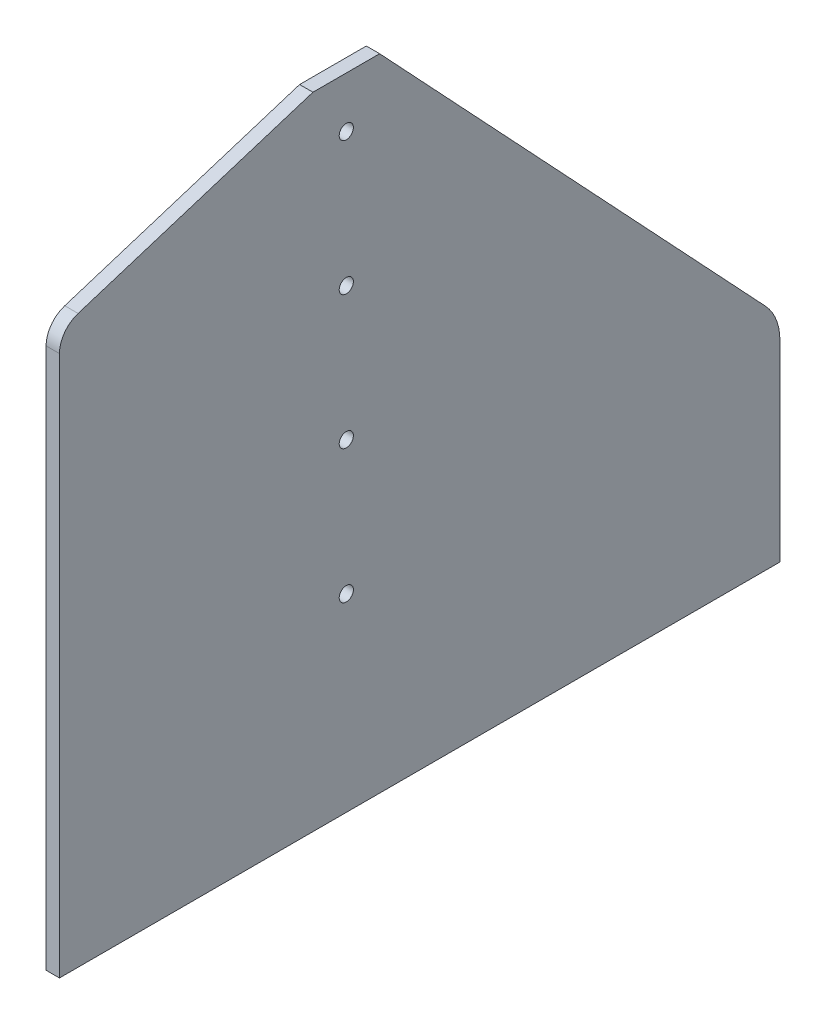
ISO-10303-21;
HEADER;
FILE_DESCRIPTION(('STEP AP214'),'2;1');
FILE_NAME('part.step','',(''),(''),'','','');
FILE_SCHEMA(('AUTOMOTIVE_DESIGN { 1 0 10303 214 1 1 1 1 }'));
ENDSEC;
DATA;
#1=APPLICATION_CONTEXT('core data for automotive mechanical design processes');
#2=APPLICATION_PROTOCOL_DEFINITION('international standard','automotive_design',2000,#1);
#3=PRODUCT_CONTEXT('',#1,'mechanical');
#4=PRODUCT('Part','Part','',(#3));
#5=PRODUCT_RELATED_PRODUCT_CATEGORY('part','',(#4));
#6=PRODUCT_DEFINITION_FORMATION('','',#4);
#7=PRODUCT_DEFINITION_CONTEXT('part definition',#1,'design');
#8=PRODUCT_DEFINITION('design','',#6,#7);
#9=PRODUCT_DEFINITION_SHAPE('','',#8);
#10=(LENGTH_UNIT() NAMED_UNIT(*) SI_UNIT(.MILLI.,.METRE.));
#11=(NAMED_UNIT(*) PLANE_ANGLE_UNIT() SI_UNIT($,.RADIAN.));
#12=(NAMED_UNIT(*) SI_UNIT($,.STERADIAN.) SOLID_ANGLE_UNIT());
#13=UNCERTAINTY_MEASURE_WITH_UNIT(LENGTH_MEASURE(1.E-05),#10,'distance_accuracy_value','');
#14=(GEOMETRIC_REPRESENTATION_CONTEXT(3) GLOBAL_UNCERTAINTY_ASSIGNED_CONTEXT((#13)) GLOBAL_UNIT_ASSIGNED_CONTEXT((#10,
#11,#12)) REPRESENTATION_CONTEXT('',''));
#15=CARTESIAN_POINT('',(0.,0.,0.));
#16=DIRECTION('',(0.,0.,1.));
#17=DIRECTION('',(1.,0.,0.));
#18=AXIS2_PLACEMENT_3D('',#15,#16,#17);
#19=CARTESIAN_POINT('',(6.35,0.,0.));
#20=DIRECTION('',(-1.,0.,0.));
#21=DIRECTION('',(0.,0.,1.));
#22=AXIS2_PLACEMENT_3D('',#19,#20,#21);
#23=PLANE('',#22);
#24=DIRECTION('',(0.,-0.301131367937098,0.953582665134142));
#25=VECTOR('',#24,1.);
#26=CARTESIAN_POINT('',(6.35,215.9,136.525));
#27=LINE('',#26,#25);
#28=CARTESIAN_POINT('',(6.35,254.,15.875));
#29=VERTEX_POINT('',#28);
#30=CARTESIAN_POINT('',(6.35,218.702831040168,127.649368372801));
#31=VERTEX_POINT('',#30);
#32=EDGE_CURVE('E159',#29,#31,#27,.T.);
#33=ORIENTED_EDGE('',*,*,#32,.T.);
#34=CARTESIAN_POINT('',(6.35,206.592331192964,123.825));
#35=DIRECTION('',(-1.,0.,0.));
#36=DIRECTION('',(0.,0.,1.));
#37=AXIS2_PLACEMENT_3D('',#34,#35,#36);
#38=CIRCLE('',#37,12.7);
#39=CARTESIAN_POINT('',(6.35,206.592331192964,136.525));
#40=VERTEX_POINT('',#39);
#41=EDGE_CURVE('E11',#31,#40,#38,.F.);
#42=ORIENTED_EDGE('',*,*,#41,.T.);
#43=DIRECTION('',(0.,-1.,0.));
#44=VECTOR('',#43,1.);
#45=CARTESIAN_POINT('',(6.35,0.,136.525));
#46=LINE('',#45,#44);
#47=CARTESIAN_POINT('',(6.35,-50.8,136.525));
#48=VERTEX_POINT('',#47);
#49=EDGE_CURVE('E161',#40,#48,#46,.T.);
#50=ORIENTED_EDGE('',*,*,#49,.T.);
#51=DIRECTION('',(0.,0.,1.));
#52=VECTOR('',#51,1.);
#53=CARTESIAN_POINT('',(6.35,-50.8,-206.375));
#54=LINE('',#53,#52);
#55=CARTESIAN_POINT('',(6.35,-50.8,-206.375));
#56=VERTEX_POINT('',#55);
#57=EDGE_CURVE('E124',#56,#48,#54,.T.);
#58=ORIENTED_EDGE('',*,*,#57,.F.);
#59=DIRECTION('',(0.,1.,0.));
#60=VECTOR('',#59,1.);
#61=CARTESIAN_POINT('',(6.35,50.8,-206.375));
#62=LINE('',#61,#60);
#63=CARTESIAN_POINT('',(6.35,40.7556340089122,-206.375));
#64=VERTEX_POINT('',#63);
#65=EDGE_CURVE('E108',#56,#64,#62,.T.);
#66=ORIENTED_EDGE('',*,*,#65,.T.);
#67=CARTESIAN_POINT('',(6.35,40.7556340089122,-180.975));
#68=DIRECTION('',(-1.,0.,0.));
#69=DIRECTION('',(0.,0.,1.));
#70=AXIS2_PLACEMENT_3D('',#67,#68,#69);
#71=CIRCLE('',#70,25.4);
#72=CARTESIAN_POINT('',(6.35,58.127738682498,-199.505244985158));
#73=VERTEX_POINT('',#72);
#74=EDGE_CURVE('E182',#64,#73,#71,.F.);
#75=ORIENTED_EDGE('',*,*,#74,.T.);
#76=DIRECTION('',(0.,0.729537204140085,0.68394112888133));
#77=VECTOR('',#76,1.);
#78=CARTESIAN_POINT('',(6.35,254.,-15.875));
#79=LINE('',#78,#77);
#80=CARTESIAN_POINT('',(6.35,254.,-15.875));
#81=VERTEX_POINT('',#80);
#82=EDGE_CURVE('E155',#73,#81,#79,.T.);
#83=ORIENTED_EDGE('',*,*,#82,.T.);
#84=DIRECTION('',(0.,0.,1.));
#85=VECTOR('',#84,1.);
#86=CARTESIAN_POINT('',(6.35,254.,15.875));
#87=LINE('',#86,#85);
#88=EDGE_CURVE('E157',#81,#29,#87,.T.);
#89=ORIENTED_EDGE('',*,*,#88,.T.);
#90=EDGE_LOOP('',(#33,#42,#50,#58,#66,#75,#83,#89));
#91=FACE_BOUND('',#90,.T.);
#92=CARTESIAN_POINT('',(6.35,39.3342043185878,0.));
#93=DIRECTION('',(1.,0.,0.));
#94=DIRECTION('',(0.,0.,-1.));
#95=AXIS2_PLACEMENT_3D('',#92,#93,#94);
#96=CIRCLE('',#95,3.37819999999998);
#97=CARTESIAN_POINT('',(6.35,39.3342043185878,-3.37819999999998));
#98=VERTEX_POINT('',#97);
#99=EDGE_CURVE('E147',#98,#98,#96,.T.);
#100=ORIENTED_EDGE('',*,*,#99,.F.);
#101=EDGE_LOOP('',(#100));
#102=FACE_BOUND('',#101,.T.);
#103=CARTESIAN_POINT('',(6.35,102.834204318588,0.));
#104=DIRECTION('',(1.,0.,0.));
#105=DIRECTION('',(0.,0.,-1.));
#106=AXIS2_PLACEMENT_3D('',#103,#104,#105);
#107=CIRCLE('',#106,3.37819999999998);
#108=CARTESIAN_POINT('',(6.35,102.834204318588,-3.37819999999998));
#109=VERTEX_POINT('',#108);
#110=EDGE_CURVE('E141',#109,#109,#107,.T.);
#111=ORIENTED_EDGE('',*,*,#110,.F.);
#112=EDGE_LOOP('',(#111));
#113=FACE_BOUND('',#112,.T.);
#114=CARTESIAN_POINT('',(6.35,166.334204318588,0.));
#115=DIRECTION('',(1.,0.,0.));
#116=DIRECTION('',(0.,0.,-1.));
#117=AXIS2_PLACEMENT_3D('',#114,#115,#116);
#118=CIRCLE('',#117,3.3782);
#119=CARTESIAN_POINT('',(6.35,166.334204318588,-3.3782));
#120=VERTEX_POINT('',#119);
#121=EDGE_CURVE('E135',#120,#120,#118,.T.);
#122=ORIENTED_EDGE('',*,*,#121,.F.);
#123=EDGE_LOOP('',(#122));
#124=FACE_BOUND('',#123,.T.);
#125=CARTESIAN_POINT('',(6.35,229.834204318588,0.));
#126=DIRECTION('',(1.,0.,0.));
#127=DIRECTION('',(0.,0.,-1.));
#128=AXIS2_PLACEMENT_3D('',#125,#126,#127);
#129=CIRCLE('',#128,3.3782);
#130=CARTESIAN_POINT('',(6.35,229.834204318588,-3.3782));
#131=VERTEX_POINT('',#130);
#132=EDGE_CURVE('E129',#131,#131,#129,.T.);
#133=ORIENTED_EDGE('',*,*,#132,.F.);
#134=EDGE_LOOP('',(#133));
#135=FACE_BOUND('',#134,.T.);
#136=ADVANCED_FACE('F35',(#91,#102,#113,#124,#135),#23,.F.);
#137=CARTESIAN_POINT('',(6.35,50.8,-206.375));
#138=DIRECTION('',(0.,0.,1.));
#139=DIRECTION('',(1.,0.,0.));
#140=AXIS2_PLACEMENT_3D('',#137,#138,#139);
#141=PLANE('',#140);
#142=DIRECTION('',(0.,1.,0.));
#143=VECTOR('',#142,1.);
#144=CARTESIAN_POINT('',(0.,50.8,-206.375));
#145=LINE('',#144,#143);
#146=CARTESIAN_POINT('',(0.,-50.8,-206.375));
#147=VERTEX_POINT('',#146);
#148=CARTESIAN_POINT('',(0.,40.7556340089122,-206.375));
#149=VERTEX_POINT('',#148);
#150=EDGE_CURVE('E115',#147,#149,#145,.T.);
#151=ORIENTED_EDGE('',*,*,#150,.T.);
#152=DIRECTION('',(-1.,0.,0.));
#153=VECTOR('',#152,1.);
#154=CARTESIAN_POINT('',(6.35,40.7556340089122,-206.375));
#155=LINE('',#154,#153);
#156=EDGE_CURVE('E180',#149,#64,#155,.F.);
#157=ORIENTED_EDGE('',*,*,#156,.T.);
#158=ORIENTED_EDGE('',*,*,#65,.F.);
#159=DIRECTION('',(1.,0.,0.));
#160=VECTOR('',#159,1.);
#161=CARTESIAN_POINT('',(0.,-50.8,-206.375));
#162=LINE('',#161,#160);
#163=EDGE_CURVE('E119',#147,#56,#162,.T.);
#164=ORIENTED_EDGE('',*,*,#163,.F.);
#165=EDGE_LOOP('',(#151,#157,#158,#164));
#166=FACE_BOUND('',#165,.T.);
#167=ADVANCED_FACE('F200',(#166),#141,.F.);
#168=CARTESIAN_POINT('',(6.35,254.,-15.875));
#169=DIRECTION('',(0.,-0.68394112888133,0.729537204140085));
#170=DIRECTION('',(0.,-0.729537204140085,-0.68394112888133));
#171=AXIS2_PLACEMENT_3D('',#168,#169,#170);
#172=PLANE('',#171);
#173=ORIENTED_EDGE('',*,*,#82,.F.);
#174=DIRECTION('',(-1.,0.,0.));
#175=VECTOR('',#174,1.);
#176=CARTESIAN_POINT('',(6.35,58.127738682498,-199.505244985158));
#177=LINE('',#176,#175);
#178=CARTESIAN_POINT('',(0.,58.127738682498,-199.505244985158));
#179=VERTEX_POINT('',#178);
#180=EDGE_CURVE('E175',#73,#179,#177,.T.);
#181=ORIENTED_EDGE('',*,*,#180,.T.);
#182=DIRECTION('',(0.,0.729537204140085,0.68394112888133));
#183=VECTOR('',#182,1.);
#184=CARTESIAN_POINT('',(0.,254.,-15.875));
#185=LINE('',#184,#183);
#186=CARTESIAN_POINT('',(0.,254.,-15.875));
#187=VERTEX_POINT('',#186);
#188=EDGE_CURVE('E165',#179,#187,#185,.T.);
#189=ORIENTED_EDGE('',*,*,#188,.T.);
#190=DIRECTION('',(-1.,0.,0.));
#191=VECTOR('',#190,1.);
#192=CARTESIAN_POINT('',(6.35,254.,-15.875));
#193=LINE('',#192,#191);
#194=EDGE_CURVE('E172',#81,#187,#193,.T.);
#195=ORIENTED_EDGE('',*,*,#194,.F.);
#196=EDGE_LOOP('',(#173,#181,#189,#195));
#197=FACE_BOUND('',#196,.T.);
#198=ADVANCED_FACE('F194',(#197),#172,.F.);
#199=CARTESIAN_POINT('',(6.35,254.,15.875));
#200=DIRECTION('',(0.,-1.,0.));
#201=DIRECTION('',(0.,0.,-1.));
#202=AXIS2_PLACEMENT_3D('',#199,#200,#201);
#203=PLANE('',#202);
#204=DIRECTION('',(0.,0.,1.));
#205=VECTOR('',#204,1.);
#206=CARTESIAN_POINT('',(0.,254.,15.875));
#207=LINE('',#206,#205);
#208=CARTESIAN_POINT('',(0.,254.,15.875));
#209=VERTEX_POINT('',#208);
#210=EDGE_CURVE('E167',#187,#209,#207,.T.);
#211=ORIENTED_EDGE('',*,*,#210,.T.);
#212=DIRECTION('',(-1.,0.,0.));
#213=VECTOR('',#212,1.);
#214=CARTESIAN_POINT('',(6.35,254.,15.875));
#215=LINE('',#214,#213);
#216=EDGE_CURVE('E163',#29,#209,#215,.T.);
#217=ORIENTED_EDGE('',*,*,#216,.F.);
#218=ORIENTED_EDGE('',*,*,#88,.F.);
#219=ORIENTED_EDGE('',*,*,#194,.T.);
#220=EDGE_LOOP('',(#211,#217,#218,#219));
#221=FACE_BOUND('',#220,.T.);
#222=ADVANCED_FACE('F231',(#221),#203,.F.);
#223=CARTESIAN_POINT('',(6.35,215.9,136.525));
#224=DIRECTION('',(0.,-0.953582665134142,-0.301131367937098));
#225=DIRECTION('',(0.,0.301131367937098,-0.953582665134142));
#226=AXIS2_PLACEMENT_3D('',#223,#224,#225);
#227=PLANE('',#226);
#228=DIRECTION('',(0.,-0.301131367937098,0.953582665134142));
#229=VECTOR('',#228,1.);
#230=CARTESIAN_POINT('',(0.,215.9,136.525));
#231=LINE('',#230,#229);
#232=CARTESIAN_POINT('',(0.,218.702831040168,127.649368372801));
#233=VERTEX_POINT('',#232);
#234=EDGE_CURVE('E109',#209,#233,#231,.T.);
#235=ORIENTED_EDGE('',*,*,#234,.T.);
#236=DIRECTION('',(-1.,0.,0.));
#237=VECTOR('',#236,1.);
#238=CARTESIAN_POINT('',(6.35,218.702831040168,127.649368372801));
#239=LINE('',#238,#237);
#240=EDGE_CURVE('E43',#233,#31,#239,.F.);
#241=ORIENTED_EDGE('',*,*,#240,.T.);
#242=ORIENTED_EDGE('',*,*,#32,.F.);
#243=ORIENTED_EDGE('',*,*,#216,.T.);
#244=EDGE_LOOP('',(#235,#241,#242,#243));
#245=FACE_BOUND('',#244,.T.);
#246=ADVANCED_FACE('F228',(#245),#227,.F.);
#247=CARTESIAN_POINT('',(6.35,0.,136.525));
#248=DIRECTION('',(0.,0.,-1.));
#249=DIRECTION('',(-1.,0.,0.));
#250=AXIS2_PLACEMENT_3D('',#247,#248,#249);
#251=PLANE('',#250);
#252=ORIENTED_EDGE('',*,*,#49,.F.);
#253=DIRECTION('',(-1.,0.,0.));
#254=VECTOR('',#253,1.);
#255=CARTESIAN_POINT('',(6.35,206.592331192964,136.525));
#256=LINE('',#255,#254);
#257=CARTESIAN_POINT('',(0.,206.592331192964,136.525));
#258=VERTEX_POINT('',#257);
#259=EDGE_CURVE('E107',#40,#258,#256,.T.);
#260=ORIENTED_EDGE('',*,*,#259,.T.);
#261=DIRECTION('',(0.,-1.,0.));
#262=VECTOR('',#261,1.);
#263=CARTESIAN_POINT('',(0.,0.,136.525));
#264=LINE('',#263,#262);
#265=CARTESIAN_POINT('',(0.,-50.8,136.525));
#266=VERTEX_POINT('',#265);
#267=EDGE_CURVE('E100',#258,#266,#264,.T.);
#268=ORIENTED_EDGE('',*,*,#267,.T.);
#269=DIRECTION('',(-1.,0.,0.));
#270=VECTOR('',#269,1.);
#271=CARTESIAN_POINT('',(6.35,-50.8,136.525));
#272=LINE('',#271,#270);
#273=EDGE_CURVE('E105',#48,#266,#272,.T.);
#274=ORIENTED_EDGE('',*,*,#273,.F.);
#275=EDGE_LOOP('',(#252,#260,#268,#274));
#276=FACE_BOUND('',#275,.T.);
#277=ADVANCED_FACE('F103',(#276),#251,.F.);
#278=CARTESIAN_POINT('',(0.,0.,0.));
#279=DIRECTION('',(-1.,0.,0.));
#280=DIRECTION('',(0.,0.,1.));
#281=AXIS2_PLACEMENT_3D('',#278,#279,#280);
#282=PLANE('',#281);
#283=CARTESIAN_POINT('',(0.,229.834204318588,0.));
#284=DIRECTION('',(-1.,0.,0.));
#285=DIRECTION('',(0.,0.,1.));
#286=AXIS2_PLACEMENT_3D('',#283,#284,#285);
#287=CIRCLE('',#286,3.3782);
#288=CARTESIAN_POINT('',(0.,229.834204318588,3.3782));
#289=VERTEX_POINT('',#288);
#290=EDGE_CURVE('E132',#289,#289,#287,.T.);
#291=ORIENTED_EDGE('',*,*,#290,.F.);
#292=EDGE_LOOP('',(#291));
#293=FACE_BOUND('',#292,.T.);
#294=CARTESIAN_POINT('',(0.,166.334204318588,0.));
#295=DIRECTION('',(-1.,0.,0.));
#296=DIRECTION('',(0.,0.,1.));
#297=AXIS2_PLACEMENT_3D('',#294,#295,#296);
#298=CIRCLE('',#297,3.3782);
#299=CARTESIAN_POINT('',(0.,166.334204318588,3.3782));
#300=VERTEX_POINT('',#299);
#301=EDGE_CURVE('E138',#300,#300,#298,.T.);
#302=ORIENTED_EDGE('',*,*,#301,.F.);
#303=EDGE_LOOP('',(#302));
#304=FACE_BOUND('',#303,.T.);
#305=CARTESIAN_POINT('',(0.,102.834204318588,0.));
#306=DIRECTION('',(-1.,0.,0.));
#307=DIRECTION('',(0.,0.,1.));
#308=AXIS2_PLACEMENT_3D('',#305,#306,#307);
#309=CIRCLE('',#308,3.37819999999999);
#310=CARTESIAN_POINT('',(0.,102.834204318588,3.37819999999999));
#311=VERTEX_POINT('',#310);
#312=EDGE_CURVE('E144',#311,#311,#309,.T.);
#313=ORIENTED_EDGE('',*,*,#312,.F.);
#314=EDGE_LOOP('',(#313));
#315=FACE_BOUND('',#314,.T.);
#316=CARTESIAN_POINT('',(0.,39.3342043185878,0.));
#317=DIRECTION('',(-1.,0.,0.));
#318=DIRECTION('',(0.,0.,1.));
#319=AXIS2_PLACEMENT_3D('',#316,#317,#318);
#320=CIRCLE('',#319,3.37819999999999);
#321=CARTESIAN_POINT('',(0.,39.3342043185878,3.37819999999999));
#322=VERTEX_POINT('',#321);
#323=EDGE_CURVE('E150',#322,#322,#320,.T.);
#324=ORIENTED_EDGE('',*,*,#323,.F.);
#325=EDGE_LOOP('',(#324));
#326=FACE_BOUND('',#325,.T.);
#327=ORIENTED_EDGE('',*,*,#267,.F.);
#328=CARTESIAN_POINT('',(0.,206.592331192964,123.825));
#329=DIRECTION('',(-1.,0.,0.));
#330=DIRECTION('',(0.,0.,1.));
#331=AXIS2_PLACEMENT_3D('',#328,#329,#330);
#332=CIRCLE('',#331,12.7);
#333=EDGE_CURVE('E57',#258,#233,#332,.T.);
#334=ORIENTED_EDGE('',*,*,#333,.T.);
#335=ORIENTED_EDGE('',*,*,#234,.F.);
#336=ORIENTED_EDGE('',*,*,#210,.F.);
#337=ORIENTED_EDGE('',*,*,#188,.F.);
#338=CARTESIAN_POINT('',(0.,40.7556340089122,-180.975));
#339=DIRECTION('',(-1.,0.,0.));
#340=DIRECTION('',(0.,0.,1.));
#341=AXIS2_PLACEMENT_3D('',#338,#339,#340);
#342=CIRCLE('',#341,25.4);
#343=EDGE_CURVE('E178',#179,#149,#342,.T.);
#344=ORIENTED_EDGE('',*,*,#343,.T.);
#345=ORIENTED_EDGE('',*,*,#150,.F.);
#346=DIRECTION('',(0.,0.,-1.));
#347=VECTOR('',#346,1.);
#348=CARTESIAN_POINT('',(0.,-50.8,136.525));
#349=LINE('',#348,#347);
#350=EDGE_CURVE('E112',#266,#147,#349,.T.);
#351=ORIENTED_EDGE('',*,*,#350,.F.);
#352=EDGE_LOOP('',(#327,#334,#335,#336,#337,#344,#345,#351));
#353=FACE_BOUND('',#352,.T.);
#354=ADVANCED_FACE('F113',(#293,#304,#315,#326,#353),#282,.T.);
#355=CARTESIAN_POINT('',(6.35,40.7556340089122,-180.975));
#356=DIRECTION('',(-1.,0.,0.));
#357=DIRECTION('',(0.,0.,1.));
#358=AXIS2_PLACEMENT_3D('',#355,#356,#357);
#359=CYLINDRICAL_SURFACE('',#358,25.4);
#360=ORIENTED_EDGE('',*,*,#74,.F.);
#361=ORIENTED_EDGE('',*,*,#156,.F.);
#362=ORIENTED_EDGE('',*,*,#343,.F.);
#363=ORIENTED_EDGE('',*,*,#180,.F.);
#364=EDGE_LOOP('',(#360,#361,#362,#363));
#365=FACE_BOUND('',#364,.T.);
#366=ADVANCED_FACE('F197',(#365),#359,.T.);
#367=CARTESIAN_POINT('',(6.35,39.3342043185878,0.));
#368=DIRECTION('',(1.,0.,0.));
#369=DIRECTION('',(0.,0.,-1.));
#370=AXIS2_PLACEMENT_3D('',#367,#368,#369);
#371=CYLINDRICAL_SURFACE('',#370,3.37819999999999);
#372=ORIENTED_EDGE('',*,*,#99,.T.);
#373=EDGE_LOOP('',(#372));
#374=FACE_BOUND('',#373,.T.);
#375=ORIENTED_EDGE('',*,*,#323,.T.);
#376=EDGE_LOOP('',(#375));
#377=FACE_BOUND('',#376,.T.);
#378=ADVANCED_FACE('F221',(#374,#377),#371,.F.);
#379=CARTESIAN_POINT('',(6.35,102.834204318588,0.));
#380=DIRECTION('',(1.,0.,0.));
#381=DIRECTION('',(0.,0.,-1.));
#382=AXIS2_PLACEMENT_3D('',#379,#380,#381);
#383=CYLINDRICAL_SURFACE('',#382,3.37819999999999);
#384=ORIENTED_EDGE('',*,*,#110,.T.);
#385=EDGE_LOOP('',(#384));
#386=FACE_BOUND('',#385,.T.);
#387=ORIENTED_EDGE('',*,*,#312,.T.);
#388=EDGE_LOOP('',(#387));
#389=FACE_BOUND('',#388,.T.);
#390=ADVANCED_FACE('F240',(#386,#389),#383,.F.);
#391=CARTESIAN_POINT('',(6.35,166.334204318588,0.));
#392=DIRECTION('',(1.,0.,0.));
#393=DIRECTION('',(0.,0.,-1.));
#394=AXIS2_PLACEMENT_3D('',#391,#392,#393);
#395=CYLINDRICAL_SURFACE('',#394,3.3782);
#396=ORIENTED_EDGE('',*,*,#121,.T.);
#397=EDGE_LOOP('',(#396));
#398=FACE_BOUND('',#397,.T.);
#399=ORIENTED_EDGE('',*,*,#301,.T.);
#400=EDGE_LOOP('',(#399));
#401=FACE_BOUND('',#400,.T.);
#402=ADVANCED_FACE('F210',(#398,#401),#395,.F.);
#403=CARTESIAN_POINT('',(6.35,229.834204318588,0.));
#404=DIRECTION('',(1.,0.,0.));
#405=DIRECTION('',(0.,0.,-1.));
#406=AXIS2_PLACEMENT_3D('',#403,#404,#405);
#407=CYLINDRICAL_SURFACE('',#406,3.3782);
#408=ORIENTED_EDGE('',*,*,#132,.T.);
#409=EDGE_LOOP('',(#408));
#410=FACE_BOUND('',#409,.T.);
#411=ORIENTED_EDGE('',*,*,#290,.T.);
#412=EDGE_LOOP('',(#411));
#413=FACE_BOUND('',#412,.T.);
#414=ADVANCED_FACE('F204',(#410,#413),#407,.F.);
#415=CARTESIAN_POINT('',(6.35,206.592331192964,123.825));
#416=DIRECTION('',(-1.,0.,0.));
#417=DIRECTION('',(0.,0.,1.));
#418=AXIS2_PLACEMENT_3D('',#415,#416,#417);
#419=CYLINDRICAL_SURFACE('',#418,12.7);
#420=ORIENTED_EDGE('',*,*,#41,.F.);
#421=ORIENTED_EDGE('',*,*,#240,.F.);
#422=ORIENTED_EDGE('',*,*,#333,.F.);
#423=ORIENTED_EDGE('',*,*,#259,.F.);
#424=EDGE_LOOP('',(#420,#421,#422,#423));
#425=FACE_BOUND('',#424,.T.);
#426=ADVANCED_FACE('F37',(#425),#419,.T.);
#427=CARTESIAN_POINT('',(0.,-50.8,0.));
#428=DIRECTION('',(0.,-1.,0.));
#429=DIRECTION('',(0.,0.,-1.));
#430=AXIS2_PLACEMENT_3D('',#427,#428,#429);
#431=PLANE('',#430);
#432=ORIENTED_EDGE('',*,*,#273,.T.);
#433=ORIENTED_EDGE('',*,*,#350,.T.);
#434=ORIENTED_EDGE('',*,*,#163,.T.);
#435=ORIENTED_EDGE('',*,*,#57,.T.);
#436=EDGE_LOOP('',(#432,#433,#434,#435));
#437=FACE_BOUND('',#436,.T.);
#438=ADVANCED_FACE('F122',(#437),#431,.T.);
#439=CLOSED_SHELL('',(#136,#167,#198,#222,#246,#277,#354,#366,#378,#390,#402,#414,#426,#438));
#440=MANIFOLD_SOLID_BREP('B2',#439);
#441=ADVANCED_BREP_SHAPE_REPRESENTATION('',(#18,#440),#14);
#442=SHAPE_DEFINITION_REPRESENTATION(#9,#441);
ENDSEC;
END-ISO-10303-21;
